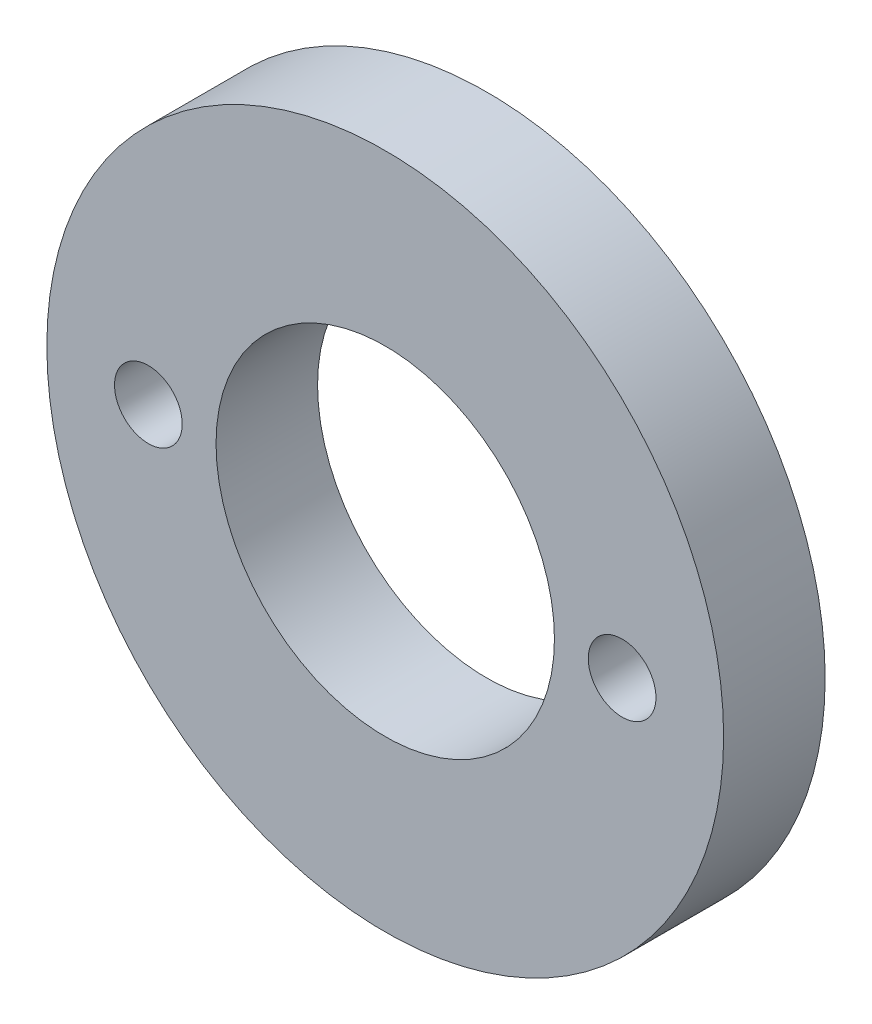
ISO-10303-21;
HEADER;
FILE_DESCRIPTION(('STEP AP214'),'2;1');
FILE_NAME('part.step','',(''),(''),'','','');
FILE_SCHEMA(('AUTOMOTIVE_DESIGN { 1 0 10303 214 1 1 1 1 }'));
ENDSEC;
DATA;
#1=APPLICATION_CONTEXT('core data for automotive mechanical design processes');
#2=APPLICATION_PROTOCOL_DEFINITION('international standard','automotive_design',2000,#1);
#3=PRODUCT_CONTEXT('',#1,'mechanical');
#4=PRODUCT('Part','Part','',(#3));
#5=PRODUCT_RELATED_PRODUCT_CATEGORY('part','',(#4));
#6=PRODUCT_DEFINITION_FORMATION('','',#4);
#7=PRODUCT_DEFINITION_CONTEXT('part definition',#1,'design');
#8=PRODUCT_DEFINITION('design','',#6,#7);
#9=PRODUCT_DEFINITION_SHAPE('','',#8);
#10=(LENGTH_UNIT() NAMED_UNIT(*) SI_UNIT(.MILLI.,.METRE.));
#11=(NAMED_UNIT(*) PLANE_ANGLE_UNIT() SI_UNIT($,.RADIAN.));
#12=(NAMED_UNIT(*) SI_UNIT($,.STERADIAN.) SOLID_ANGLE_UNIT());
#13=UNCERTAINTY_MEASURE_WITH_UNIT(LENGTH_MEASURE(1.E-05),#10,'distance_accuracy_value','');
#14=(GEOMETRIC_REPRESENTATION_CONTEXT(3) GLOBAL_UNCERTAINTY_ASSIGNED_CONTEXT((#13)) GLOBAL_UNIT_ASSIGNED_CONTEXT((#10,
#11,#12)) REPRESENTATION_CONTEXT('',''));
#15=CARTESIAN_POINT('',(0.,0.,0.));
#16=DIRECTION('',(0.,0.,1.));
#17=DIRECTION('',(1.,0.,0.));
#18=AXIS2_PLACEMENT_3D('',#15,#16,#17);
#19=CARTESIAN_POINT('',(0.,0.,1.5));
#20=DIRECTION('',(0.,0.,1.));
#21=DIRECTION('',(1.,0.,0.));
#22=AXIS2_PLACEMENT_3D('',#19,#20,#21);
#23=PLANE('',#22);
#24=CARTESIAN_POINT('',(7.,0.,1.5));
#25=DIRECTION('',(0.,0.,1.));
#26=DIRECTION('',(-1.,0.,0.));
#27=AXIS2_PLACEMENT_3D('',#24,#25,#26);
#28=CIRCLE('',#27,1.);
#29=CARTESIAN_POINT('',(6.,0.,1.5));
#30=VERTEX_POINT('',#29);
#31=EDGE_CURVE('E61',#30,#30,#28,.T.);
#32=ORIENTED_EDGE('',*,*,#31,.F.);
#33=EDGE_LOOP('',(#32));
#34=FACE_BOUND('',#33,.T.);
#35=CARTESIAN_POINT('',(-7.,0.,1.5));
#36=DIRECTION('',(0.,0.,1.));
#37=DIRECTION('',(1.,0.,0.));
#38=AXIS2_PLACEMENT_3D('',#35,#36,#37);
#39=CIRCLE('',#38,1.);
#40=CARTESIAN_POINT('',(-6.,0.,1.5));
#41=VERTEX_POINT('',#40);
#42=EDGE_CURVE('E55',#41,#41,#39,.T.);
#43=ORIENTED_EDGE('',*,*,#42,.F.);
#44=EDGE_LOOP('',(#43));
#45=FACE_BOUND('',#44,.T.);
#46=CARTESIAN_POINT('',(0.,0.,1.5));
#47=DIRECTION('',(0.,0.,1.));
#48=DIRECTION('',(1.,0.,0.));
#49=AXIS2_PLACEMENT_3D('',#46,#47,#48);
#50=CIRCLE('',#49,10.);
#51=CARTESIAN_POINT('',(10.,0.,1.5));
#52=VERTEX_POINT('',#51);
#53=EDGE_CURVE('E10',#52,#52,#50,.T.);
#54=ORIENTED_EDGE('',*,*,#53,.T.);
#55=EDGE_LOOP('',(#54));
#56=FACE_BOUND('',#55,.T.);
#57=CARTESIAN_POINT('',(0.,0.,1.5));
#58=DIRECTION('',(0.,0.,1.));
#59=DIRECTION('',(1.,0.,0.));
#60=AXIS2_PLACEMENT_3D('',#57,#58,#59);
#61=CIRCLE('',#60,5.);
#62=CARTESIAN_POINT('',(5.,0.,1.5));
#63=VERTEX_POINT('',#62);
#64=EDGE_CURVE('E47',#63,#63,#61,.T.);
#65=ORIENTED_EDGE('',*,*,#64,.F.);
#66=EDGE_LOOP('',(#65));
#67=FACE_BOUND('',#66,.T.);
#68=ADVANCED_FACE('F36',(#34,#45,#56,#67),#23,.T.);
#69=CARTESIAN_POINT('',(0.,0.,-1.5));
#70=DIRECTION('',(0.,0.,1.));
#71=DIRECTION('',(1.,0.,0.));
#72=AXIS2_PLACEMENT_3D('',#69,#70,#71);
#73=PLANE('',#72);
#74=CARTESIAN_POINT('',(7.,0.,-1.5));
#75=DIRECTION('',(0.,0.,1.));
#76=DIRECTION('',(-1.,0.,0.));
#77=AXIS2_PLACEMENT_3D('',#74,#75,#76);
#78=CIRCLE('',#77,1.);
#79=CARTESIAN_POINT('',(6.,0.,-1.5));
#80=VERTEX_POINT('',#79);
#81=EDGE_CURVE('E58',#80,#80,#78,.T.);
#82=ORIENTED_EDGE('',*,*,#81,.T.);
#83=EDGE_LOOP('',(#82));
#84=FACE_BOUND('',#83,.T.);
#85=CARTESIAN_POINT('',(-7.,0.,-1.5));
#86=DIRECTION('',(0.,0.,1.));
#87=DIRECTION('',(1.,0.,0.));
#88=AXIS2_PLACEMENT_3D('',#85,#86,#87);
#89=CIRCLE('',#88,1.);
#90=CARTESIAN_POINT('',(-6.,0.,-1.5));
#91=VERTEX_POINT('',#90);
#92=EDGE_CURVE('E52',#91,#91,#89,.T.);
#93=ORIENTED_EDGE('',*,*,#92,.T.);
#94=EDGE_LOOP('',(#93));
#95=FACE_BOUND('',#94,.T.);
#96=CARTESIAN_POINT('',(0.,0.,-1.5));
#97=DIRECTION('',(0.,0.,1.));
#98=DIRECTION('',(1.,0.,0.));
#99=AXIS2_PLACEMENT_3D('',#96,#97,#98);
#100=CIRCLE('',#99,10.);
#101=CARTESIAN_POINT('',(10.,0.,-1.5));
#102=VERTEX_POINT('',#101);
#103=EDGE_CURVE('E40',#102,#102,#100,.T.);
#104=ORIENTED_EDGE('',*,*,#103,.F.);
#105=EDGE_LOOP('',(#104));
#106=FACE_BOUND('',#105,.T.);
#107=CARTESIAN_POINT('',(0.,0.,-1.5));
#108=DIRECTION('',(0.,0.,1.));
#109=DIRECTION('',(1.,0.,0.));
#110=AXIS2_PLACEMENT_3D('',#107,#108,#109);
#111=CIRCLE('',#110,5.);
#112=CARTESIAN_POINT('',(5.,0.,-1.5));
#113=VERTEX_POINT('',#112);
#114=EDGE_CURVE('E49',#113,#113,#111,.T.);
#115=ORIENTED_EDGE('',*,*,#114,.T.);
#116=EDGE_LOOP('',(#115));
#117=FACE_BOUND('',#116,.T.);
#118=ADVANCED_FACE('F67',(#84,#95,#106,#117),#73,.F.);
#119=CARTESIAN_POINT('',(0.,0.,1.5));
#120=DIRECTION('',(0.,0.,-1.));
#121=DIRECTION('',(-1.,0.,0.));
#122=AXIS2_PLACEMENT_3D('',#119,#120,#121);
#123=CYLINDRICAL_SURFACE('',#122,10.);
#124=ORIENTED_EDGE('',*,*,#53,.F.);
#125=EDGE_LOOP('',(#124));
#126=FACE_BOUND('',#125,.T.);
#127=ORIENTED_EDGE('',*,*,#103,.T.);
#128=EDGE_LOOP('',(#127));
#129=FACE_BOUND('',#128,.T.);
#130=ADVANCED_FACE('F38',(#126,#129),#123,.T.);
#131=CARTESIAN_POINT('',(0.,0.,1.5));
#132=DIRECTION('',(0.,0.,-1.));
#133=DIRECTION('',(-1.,0.,0.));
#134=AXIS2_PLACEMENT_3D('',#131,#132,#133);
#135=CYLINDRICAL_SURFACE('',#134,5.);
#136=ORIENTED_EDGE('',*,*,#64,.T.);
#137=EDGE_LOOP('',(#136));
#138=FACE_BOUND('',#137,.T.);
#139=ORIENTED_EDGE('',*,*,#114,.F.);
#140=EDGE_LOOP('',(#139));
#141=FACE_BOUND('',#140,.T.);
#142=ADVANCED_FACE('F84',(#138,#141),#135,.F.);
#143=CARTESIAN_POINT('',(-7.,0.,-1.5));
#144=DIRECTION('',(0.,0.,1.));
#145=DIRECTION('',(1.,0.,0.));
#146=AXIS2_PLACEMENT_3D('',#143,#144,#145);
#147=CYLINDRICAL_SURFACE('',#146,1.);
#148=ORIENTED_EDGE('',*,*,#92,.F.);
#149=EDGE_LOOP('',(#148));
#150=FACE_BOUND('',#149,.T.);
#151=ORIENTED_EDGE('',*,*,#42,.T.);
#152=EDGE_LOOP('',(#151));
#153=FACE_BOUND('',#152,.T.);
#154=ADVANCED_FACE('F73',(#150,#153),#147,.F.);
#155=CARTESIAN_POINT('',(7.,0.,-1.5));
#156=DIRECTION('',(0.,0.,1.));
#157=DIRECTION('',(1.,0.,0.));
#158=AXIS2_PLACEMENT_3D('',#155,#156,#157);
#159=CYLINDRICAL_SURFACE('',#158,1.);
#160=ORIENTED_EDGE('',*,*,#81,.F.);
#161=EDGE_LOOP('',(#160));
#162=FACE_BOUND('',#161,.T.);
#163=ORIENTED_EDGE('',*,*,#31,.T.);
#164=EDGE_LOOP('',(#163));
#165=FACE_BOUND('',#164,.T.);
#166=ADVANCED_FACE('F70',(#162,#165),#159,.F.);
#167=CLOSED_SHELL('',(#68,#118,#130,#142,#154,#166));
#168=MANIFOLD_SOLID_BREP('B2',#167);
#169=ADVANCED_BREP_SHAPE_REPRESENTATION('',(#18,#168),#14);
#170=SHAPE_DEFINITION_REPRESENTATION(#9,#169);
ENDSEC;
END-ISO-10303-21;
